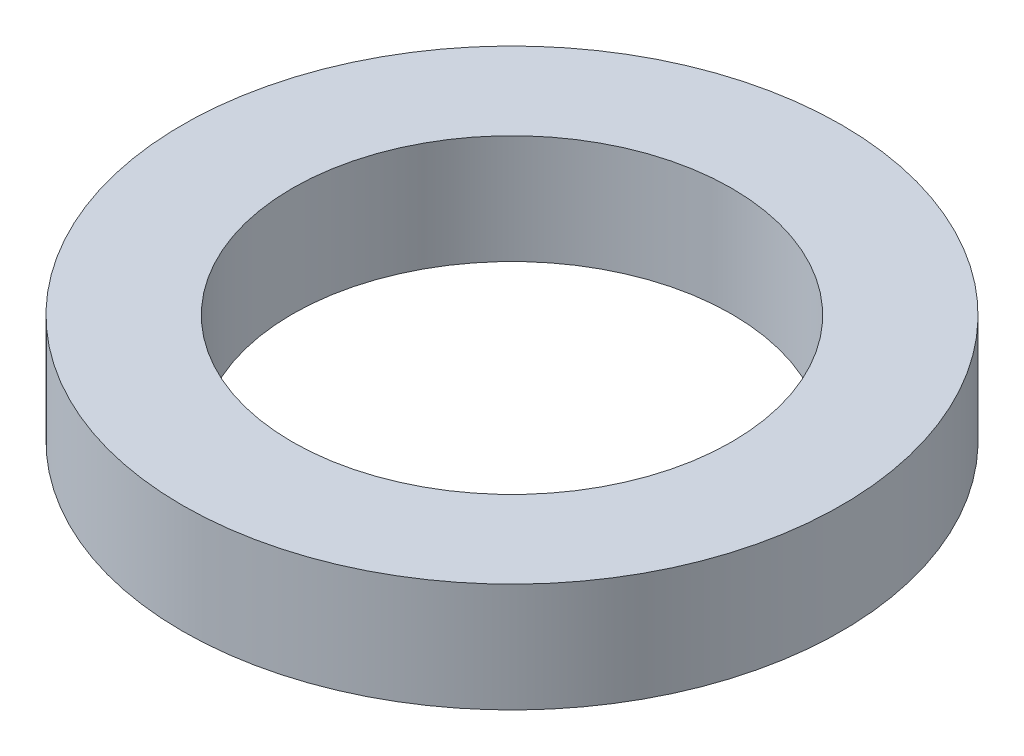
ISO-10303-21;
HEADER;
FILE_DESCRIPTION(('STEP AP214'),'2;1');
FILE_NAME('part.step','',(''),(''),'','','');
FILE_SCHEMA(('AUTOMOTIVE_DESIGN { 1 0 10303 214 1 1 1 1 }'));
ENDSEC;
DATA;
#1=APPLICATION_CONTEXT('core data for automotive mechanical design processes');
#2=APPLICATION_PROTOCOL_DEFINITION('international standard','automotive_design',2000,#1);
#3=PRODUCT_CONTEXT('',#1,'mechanical');
#4=PRODUCT('Part','Part','',(#3));
#5=PRODUCT_RELATED_PRODUCT_CATEGORY('part','',(#4));
#6=PRODUCT_DEFINITION_FORMATION('','',#4);
#7=PRODUCT_DEFINITION_CONTEXT('part definition',#1,'design');
#8=PRODUCT_DEFINITION('design','',#6,#7);
#9=PRODUCT_DEFINITION_SHAPE('','',#8);
#10=(LENGTH_UNIT() NAMED_UNIT(*) SI_UNIT(.MILLI.,.METRE.));
#11=(NAMED_UNIT(*) PLANE_ANGLE_UNIT() SI_UNIT($,.RADIAN.));
#12=(NAMED_UNIT(*) SI_UNIT($,.STERADIAN.) SOLID_ANGLE_UNIT());
#13=UNCERTAINTY_MEASURE_WITH_UNIT(LENGTH_MEASURE(1.E-05),#10,'distance_accuracy_value','');
#14=(GEOMETRIC_REPRESENTATION_CONTEXT(3) GLOBAL_UNCERTAINTY_ASSIGNED_CONTEXT((#13)) GLOBAL_UNIT_ASSIGNED_CONTEXT((#10,
#11,#12)) REPRESENTATION_CONTEXT('',''));
#15=CARTESIAN_POINT('',(0.,0.,0.));
#16=DIRECTION('',(0.,0.,1.));
#17=DIRECTION('',(1.,0.,0.));
#18=AXIS2_PLACEMENT_3D('',#15,#16,#17);
#19=CARTESIAN_POINT('',(0.,1.5748,0.));
#20=DIRECTION('',(0.,1.,0.));
#21=DIRECTION('',(0.,0.,1.));
#22=AXIS2_PLACEMENT_3D('',#19,#20,#21);
#23=PLANE('',#22);
#24=CARTESIAN_POINT('',(0.,1.5748,0.));
#25=DIRECTION('',(0.,1.,0.));
#26=DIRECTION('',(0.,0.,1.));
#27=AXIS2_PLACEMENT_3D('',#24,#25,#26);
#28=CIRCLE('',#27,4.7625);
#29=CARTESIAN_POINT('',(0.,1.5748,4.7625));
#30=VERTEX_POINT('',#29);
#31=EDGE_CURVE('E10',#30,#30,#28,.T.);
#32=ORIENTED_EDGE('',*,*,#31,.T.);
#33=EDGE_LOOP('',(#32));
#34=FACE_BOUND('',#33,.T.);
#35=CARTESIAN_POINT('',(0.,1.5748,0.));
#36=DIRECTION('',(0.,1.,0.));
#37=DIRECTION('',(0.,0.,1.));
#38=AXIS2_PLACEMENT_3D('',#35,#36,#37);
#39=CIRCLE('',#38,3.175);
#40=CARTESIAN_POINT('',(0.,1.5748,3.175));
#41=VERTEX_POINT('',#40);
#42=EDGE_CURVE('E42',#41,#41,#39,.T.);
#43=ORIENTED_EDGE('',*,*,#42,.F.);
#44=EDGE_LOOP('',(#43));
#45=FACE_BOUND('',#44,.T.);
#46=ADVANCED_FACE('F31',(#34,#45),#23,.T.);
#47=CARTESIAN_POINT('',(0.,0.,0.));
#48=DIRECTION('',(0.,1.,0.));
#49=DIRECTION('',(0.,0.,1.));
#50=AXIS2_PLACEMENT_3D('',#47,#48,#49);
#51=PLANE('',#50);
#52=CARTESIAN_POINT('',(0.,0.,0.));
#53=DIRECTION('',(0.,1.,0.));
#54=DIRECTION('',(0.,0.,1.));
#55=AXIS2_PLACEMENT_3D('',#52,#53,#54);
#56=CIRCLE('',#55,4.7625);
#57=CARTESIAN_POINT('',(0.,0.,4.7625));
#58=VERTEX_POINT('',#57);
#59=EDGE_CURVE('E35',#58,#58,#56,.T.);
#60=ORIENTED_EDGE('',*,*,#59,.F.);
#61=EDGE_LOOP('',(#60));
#62=FACE_BOUND('',#61,.T.);
#63=CARTESIAN_POINT('',(0.,0.,0.));
#64=DIRECTION('',(0.,1.,0.));
#65=DIRECTION('',(0.,0.,1.));
#66=AXIS2_PLACEMENT_3D('',#63,#64,#65);
#67=CIRCLE('',#66,3.175);
#68=CARTESIAN_POINT('',(0.,0.,3.175));
#69=VERTEX_POINT('',#68);
#70=EDGE_CURVE('E44',#69,#69,#67,.T.);
#71=ORIENTED_EDGE('',*,*,#70,.T.);
#72=EDGE_LOOP('',(#71));
#73=FACE_BOUND('',#72,.T.);
#74=ADVANCED_FACE('F54',(#62,#73),#51,.F.);
#75=CARTESIAN_POINT('',(0.,1.5748,0.));
#76=DIRECTION('',(0.,-1.,0.));
#77=DIRECTION('',(0.,0.,-1.));
#78=AXIS2_PLACEMENT_3D('',#75,#76,#77);
#79=CYLINDRICAL_SURFACE('',#78,4.7625);
#80=ORIENTED_EDGE('',*,*,#31,.F.);
#81=EDGE_LOOP('',(#80));
#82=FACE_BOUND('',#81,.T.);
#83=ORIENTED_EDGE('',*,*,#59,.T.);
#84=EDGE_LOOP('',(#83));
#85=FACE_BOUND('',#84,.T.);
#86=ADVANCED_FACE('F33',(#82,#85),#79,.T.);
#87=CARTESIAN_POINT('',(0.,1.5748,0.));
#88=DIRECTION('',(0.,-1.,0.));
#89=DIRECTION('',(0.,0.,-1.));
#90=AXIS2_PLACEMENT_3D('',#87,#88,#89);
#91=CYLINDRICAL_SURFACE('',#90,3.175);
#92=ORIENTED_EDGE('',*,*,#42,.T.);
#93=EDGE_LOOP('',(#92));
#94=FACE_BOUND('',#93,.T.);
#95=ORIENTED_EDGE('',*,*,#70,.F.);
#96=EDGE_LOOP('',(#95));
#97=FACE_BOUND('',#96,.T.);
#98=ADVANCED_FACE('F50',(#94,#97),#91,.F.);
#99=CLOSED_SHELL('',(#46,#74,#86,#98));
#100=MANIFOLD_SOLID_BREP('B2',#99);
#101=ADVANCED_BREP_SHAPE_REPRESENTATION('',(#18,#100),#14);
#102=SHAPE_DEFINITION_REPRESENTATION(#9,#101);
ENDSEC;
END-ISO-10303-21;
